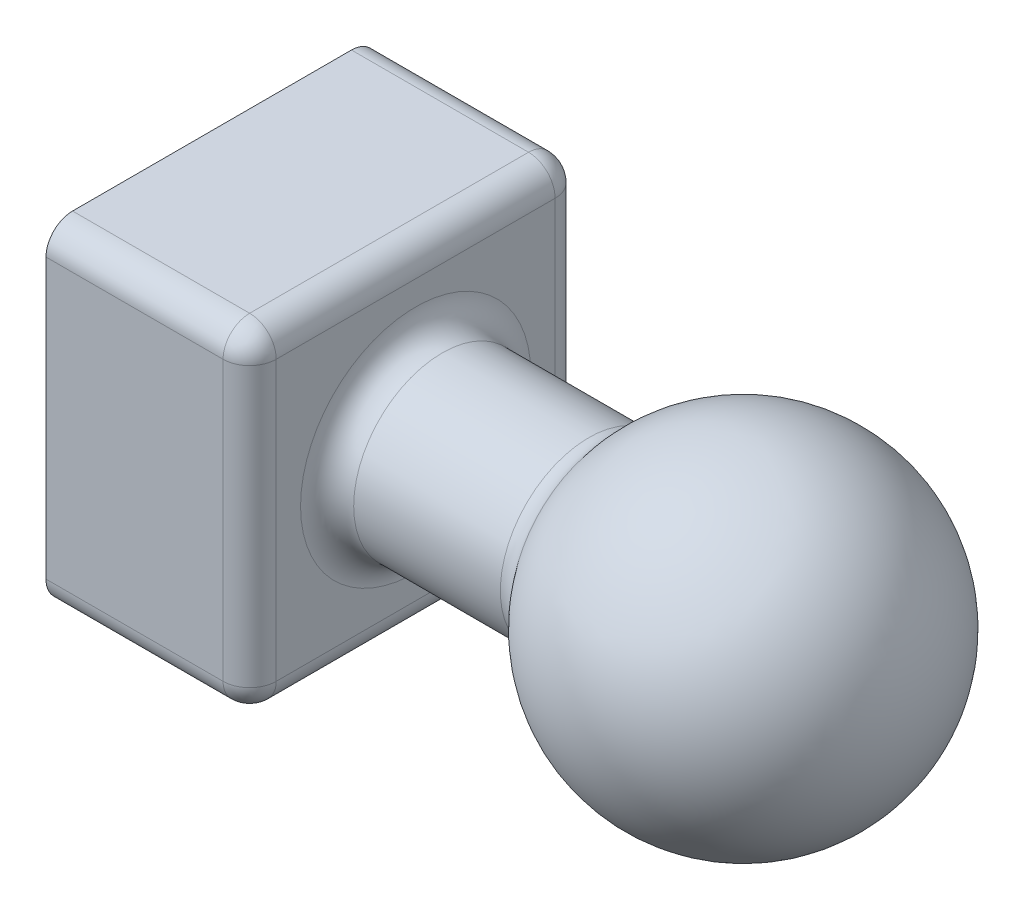
ISO-10303-21;
HEADER;
FILE_DESCRIPTION(('STEP AP214'),'2;1');
FILE_NAME('part.step','',(''),(''),'','','');
FILE_SCHEMA(('AUTOMOTIVE_DESIGN { 1 0 10303 214 1 1 1 1 }'));
ENDSEC;
DATA;
#1=APPLICATION_CONTEXT('core data for automotive mechanical design processes');
#2=APPLICATION_PROTOCOL_DEFINITION('international standard','automotive_design',2000,#1);
#3=PRODUCT_CONTEXT('',#1,'mechanical');
#4=PRODUCT('Part','Part','',(#3));
#5=PRODUCT_RELATED_PRODUCT_CATEGORY('part','',(#4));
#6=PRODUCT_DEFINITION_FORMATION('','',#4);
#7=PRODUCT_DEFINITION_CONTEXT('part definition',#1,'design');
#8=PRODUCT_DEFINITION('design','',#6,#7);
#9=PRODUCT_DEFINITION_SHAPE('','',#8);
#10=(LENGTH_UNIT() NAMED_UNIT(*) SI_UNIT(.MILLI.,.METRE.));
#11=(NAMED_UNIT(*) PLANE_ANGLE_UNIT() SI_UNIT($,.RADIAN.));
#12=(NAMED_UNIT(*) SI_UNIT($,.STERADIAN.) SOLID_ANGLE_UNIT());
#13=UNCERTAINTY_MEASURE_WITH_UNIT(LENGTH_MEASURE(1.E-05),#10,'distance_accuracy_value','');
#14=(GEOMETRIC_REPRESENTATION_CONTEXT(3) GLOBAL_UNCERTAINTY_ASSIGNED_CONTEXT((#13)) GLOBAL_UNIT_ASSIGNED_CONTEXT((#10,
#11,#12)) REPRESENTATION_CONTEXT('',''));
#15=CARTESIAN_POINT('',(0.,0.,0.));
#16=DIRECTION('',(0.,0.,1.));
#17=DIRECTION('',(1.,0.,0.));
#18=AXIS2_PLACEMENT_3D('',#15,#16,#17);
#19=CARTESIAN_POINT('',(37.,0.,0.));
#20=DIRECTION('',(1.,0.,0.));
#21=DIRECTION('',(0.,-1.,0.));
#22=AXIS2_PLACEMENT_3D('',#19,#20,#21);
#23=SPHERICAL_SURFACE('',#22,18.75);
#24=CARTESIAN_POINT('',(21.9677689720071,0.,0.));
#25=DIRECTION('',(1.,0.,0.));
#26=DIRECTION('',(0.,0.,-1.));
#27=AXIS2_PLACEMENT_3D('',#24,#25,#26);
#28=CIRCLE('',#27,11.2068965517241);
#29=CARTESIAN_POINT('',(21.9677689720071,0.,-11.2068965517241));
#30=VERTEX_POINT('',#29);
#31=EDGE_CURVE('E186',#30,#30,#28,.T.);
#32=ORIENTED_EDGE('',*,*,#31,.T.);
#33=EDGE_LOOP('',(#32));
#34=FACE_BOUND('',#33,.T.);
#35=ADVANCED_FACE('F39',(#34),#23,.T.);
#36=CARTESIAN_POINT('',(55.75,0.,0.));
#37=DIRECTION('',(1.,0.,0.));
#38=DIRECTION('',(0.,0.,-1.));
#39=AXIS2_PLACEMENT_3D('',#36,#37,#38);
#40=CYLINDRICAL_SURFACE('',#39,10.);
#41=CARTESIAN_POINT('',(3.,0.,0.));
#42=DIRECTION('',(-1.,0.,0.));
#43=DIRECTION('',(0.,0.,1.));
#44=AXIS2_PLACEMENT_3D('',#41,#42,#43);
#45=CIRCLE('',#44,10.);
#46=CARTESIAN_POINT('',(3.,0.,10.));
#47=VERTEX_POINT('',#46);
#48=EDGE_CURVE('E183',#47,#47,#45,.F.);
#49=ORIENTED_EDGE('',*,*,#48,.T.);
#50=EDGE_LOOP('',(#49));
#51=FACE_BOUND('',#50,.T.);
#52=CARTESIAN_POINT('',(19.5626120075282,0.,0.));
#53=DIRECTION('',(1.,0.,0.));
#54=DIRECTION('',(0.,0.,-1.));
#55=AXIS2_PLACEMENT_3D('',#52,#53,#54);
#56=CIRCLE('',#55,10.);
#57=CARTESIAN_POINT('',(19.5626120075282,0.,-10.));
#58=VERTEX_POINT('',#57);
#59=EDGE_CURVE('E180',#58,#58,#56,.F.);
#60=ORIENTED_EDGE('',*,*,#59,.T.);
#61=EDGE_LOOP('',(#60));
#62=FACE_BOUND('',#61,.T.);
#63=ADVANCED_FACE('F236',(#51,#62),#40,.T.);
#64=CARTESIAN_POINT('',(0.,0.,0.));
#65=DIRECTION('',(-1.,0.,0.));
#66=DIRECTION('',(0.,0.,1.));
#67=AXIS2_PLACEMENT_3D('',#64,#65,#66);
#68=PLANE('',#67);
#69=DIRECTION('',(0.,0.,1.));
#70=VECTOR('',#69,1.);
#71=CARTESIAN_POINT('',(0.,-15.75,0.));
#72=LINE('',#71,#70);
#73=CARTESIAN_POINT('',(0.,-15.75,15.75));
#74=VERTEX_POINT('',#73);
#75=CARTESIAN_POINT('',(0.,-15.75,-15.75));
#76=VERTEX_POINT('',#75);
#77=EDGE_CURVE('E54',#74,#76,#72,.F.);
#78=ORIENTED_EDGE('',*,*,#77,.T.);
#79=DIRECTION('',(0.,-1.,0.));
#80=VECTOR('',#79,1.);
#81=CARTESIAN_POINT('',(0.,0.,-15.75));
#82=LINE('',#81,#80);
#83=CARTESIAN_POINT('',(0.,15.75,-15.75));
#84=VERTEX_POINT('',#83);
#85=EDGE_CURVE('E178',#76,#84,#82,.F.);
#86=ORIENTED_EDGE('',*,*,#85,.T.);
#87=DIRECTION('',(0.,0.,-1.));
#88=VECTOR('',#87,1.);
#89=CARTESIAN_POINT('',(0.,15.75,0.));
#90=LINE('',#89,#88);
#91=CARTESIAN_POINT('',(0.,15.75,15.75));
#92=VERTEX_POINT('',#91);
#93=EDGE_CURVE('E175',#84,#92,#90,.F.);
#94=ORIENTED_EDGE('',*,*,#93,.T.);
#95=DIRECTION('',(0.,1.,0.));
#96=VECTOR('',#95,1.);
#97=CARTESIAN_POINT('',(0.,0.,15.75));
#98=LINE('',#97,#96);
#99=EDGE_CURVE('E173',#92,#74,#98,.F.);
#100=ORIENTED_EDGE('',*,*,#99,.T.);
#101=EDGE_LOOP('',(#78,#86,#94,#100));
#102=FACE_BOUND('',#101,.T.);
#103=CARTESIAN_POINT('',(0.,0.,0.));
#104=DIRECTION('',(-1.,0.,0.));
#105=DIRECTION('',(0.,0.,1.));
#106=AXIS2_PLACEMENT_3D('',#103,#104,#105);
#107=CIRCLE('',#106,13.);
#108=CARTESIAN_POINT('',(0.,0.,13.));
#109=VERTEX_POINT('',#108);
#110=EDGE_CURVE('E170',#109,#109,#107,.T.);
#111=ORIENTED_EDGE('',*,*,#110,.T.);
#112=EDGE_LOOP('',(#111));
#113=FACE_BOUND('',#112,.T.);
#114=ADVANCED_FACE('F242',(#102,#113),#68,.F.);
#115=CARTESIAN_POINT('',(-23.,0.,0.));
#116=DIRECTION('',(1.,0.,0.));
#117=DIRECTION('',(0.,0.,-1.));
#118=AXIS2_PLACEMENT_3D('',#115,#116,#117);
#119=PLANE('',#118);
#120=CARTESIAN_POINT('',(-23.,0.,0.));
#121=DIRECTION('',(1.,0.,0.));
#122=DIRECTION('',(0.,0.,-1.));
#123=AXIS2_PLACEMENT_3D('',#120,#121,#122);
#124=CIRCLE('',#123,17.);
#125=CARTESIAN_POINT('',(-23.,0.,-17.));
#126=VERTEX_POINT('',#125);
#127=EDGE_CURVE('E11',#126,#126,#124,.T.);
#128=ORIENTED_EDGE('',*,*,#127,.T.);
#129=EDGE_LOOP('',(#128));
#130=FACE_BOUND('',#129,.T.);
#131=DIRECTION('',(0.,0.,-1.));
#132=VECTOR('',#131,1.);
#133=CARTESIAN_POINT('',(-23.,18.75,-18.75));
#134=LINE('',#133,#132);
#135=CARTESIAN_POINT('',(-23.,18.75,15.75));
#136=VERTEX_POINT('',#135);
#137=CARTESIAN_POINT('',(-23.,18.75,-15.75));
#138=VERTEX_POINT('',#137);
#139=EDGE_CURVE('E126',#136,#138,#134,.T.);
#140=ORIENTED_EDGE('',*,*,#139,.T.);
#141=CARTESIAN_POINT('',(-23.,15.75,-15.75));
#142=DIRECTION('',(1.,0.,0.));
#143=DIRECTION('',(0.,0.,-1.));
#144=AXIS2_PLACEMENT_3D('',#141,#142,#143);
#145=CIRCLE('',#144,3.);
#146=CARTESIAN_POINT('',(-23.,15.75,-18.75));
#147=VERTEX_POINT('',#146);
#148=EDGE_CURVE('E120',#138,#147,#145,.F.);
#149=ORIENTED_EDGE('',*,*,#148,.T.);
#150=DIRECTION('',(0.,-1.,0.));
#151=VECTOR('',#150,1.);
#152=CARTESIAN_POINT('',(-23.,-18.75,-18.75));
#153=LINE('',#152,#151);
#154=CARTESIAN_POINT('',(-23.,-15.75,-18.75));
#155=VERTEX_POINT('',#154);
#156=EDGE_CURVE('E123',#147,#155,#153,.T.);
#157=ORIENTED_EDGE('',*,*,#156,.T.);
#158=CARTESIAN_POINT('',(-23.,-15.75,-15.75));
#159=DIRECTION('',(1.,0.,0.));
#160=DIRECTION('',(0.,0.,-1.));
#161=AXIS2_PLACEMENT_3D('',#158,#159,#160);
#162=CIRCLE('',#161,3.);
#163=CARTESIAN_POINT('',(-23.,-18.75,-15.75));
#164=VERTEX_POINT('',#163);
#165=EDGE_CURVE('E131',#155,#164,#162,.F.);
#166=ORIENTED_EDGE('',*,*,#165,.T.);
#167=DIRECTION('',(0.,0.,1.));
#168=VECTOR('',#167,1.);
#169=CARTESIAN_POINT('',(-23.,-18.75,-18.75));
#170=LINE('',#169,#168);
#171=CARTESIAN_POINT('',(-23.,-18.75,15.75));
#172=VERTEX_POINT('',#171);
#173=EDGE_CURVE('E139',#164,#172,#170,.T.);
#174=ORIENTED_EDGE('',*,*,#173,.T.);
#175=CARTESIAN_POINT('',(-23.,-15.75,15.75));
#176=DIRECTION('',(1.,0.,0.));
#177=DIRECTION('',(0.,0.,-1.));
#178=AXIS2_PLACEMENT_3D('',#175,#176,#177);
#179=CIRCLE('',#178,3.);
#180=CARTESIAN_POINT('',(-23.,-15.75,18.75));
#181=VERTEX_POINT('',#180);
#182=EDGE_CURVE('E154',#172,#181,#179,.F.);
#183=ORIENTED_EDGE('',*,*,#182,.T.);
#184=DIRECTION('',(0.,1.,0.));
#185=VECTOR('',#184,1.);
#186=CARTESIAN_POINT('',(-23.,-18.75,18.75));
#187=LINE('',#186,#185);
#188=CARTESIAN_POINT('',(-23.,15.75,18.75));
#189=VERTEX_POINT('',#188);
#190=EDGE_CURVE('E219',#181,#189,#187,.T.);
#191=ORIENTED_EDGE('',*,*,#190,.T.);
#192=CARTESIAN_POINT('',(-23.,15.75,15.75));
#193=DIRECTION('',(1.,0.,0.));
#194=DIRECTION('',(0.,0.,-1.));
#195=AXIS2_PLACEMENT_3D('',#192,#193,#194);
#196=CIRCLE('',#195,3.);
#197=EDGE_CURVE('E156',#189,#136,#196,.F.);
#198=ORIENTED_EDGE('',*,*,#197,.T.);
#199=EDGE_LOOP('',(#140,#149,#157,#166,#174,#183,#191,#198));
#200=FACE_BOUND('',#199,.T.);
#201=ADVANCED_FACE('F122',(#130,#200),#119,.F.);
#202=CARTESIAN_POINT('',(-23.,-18.75,18.75));
#203=DIRECTION('',(0.,0.,-1.));
#204=DIRECTION('',(0.,1.,0.));
#205=AXIS2_PLACEMENT_3D('',#202,#203,#204);
#206=PLANE('',#205);
#207=DIRECTION('',(0.,1.,0.));
#208=VECTOR('',#207,1.);
#209=CARTESIAN_POINT('',(-3.,-18.75,18.75));
#210=LINE('',#209,#208);
#211=CARTESIAN_POINT('',(-3.,-15.75,18.75));
#212=VERTEX_POINT('',#211);
#213=CARTESIAN_POINT('',(-3.,15.75,18.75));
#214=VERTEX_POINT('',#213);
#215=EDGE_CURVE('E164',#212,#214,#210,.T.);
#216=ORIENTED_EDGE('',*,*,#215,.T.);
#217=DIRECTION('',(1.,0.,0.));
#218=VECTOR('',#217,1.);
#219=CARTESIAN_POINT('',(-23.,15.75,18.75));
#220=LINE('',#219,#218);
#221=EDGE_CURVE('E168',#214,#189,#220,.F.);
#222=ORIENTED_EDGE('',*,*,#221,.T.);
#223=ORIENTED_EDGE('',*,*,#190,.F.);
#224=DIRECTION('',(1.,0.,0.));
#225=VECTOR('',#224,1.);
#226=CARTESIAN_POINT('',(-23.,-15.75,18.75));
#227=LINE('',#226,#225);
#228=EDGE_CURVE('E166',#181,#212,#227,.T.);
#229=ORIENTED_EDGE('',*,*,#228,.T.);
#230=EDGE_LOOP('',(#216,#222,#223,#229));
#231=FACE_BOUND('',#230,.T.);
#232=ADVANCED_FACE('F309',(#231),#206,.F.);
#233=CARTESIAN_POINT('',(-23.,18.75,-18.75));
#234=DIRECTION('',(0.,-1.,0.));
#235=DIRECTION('',(0.,0.,-1.));
#236=AXIS2_PLACEMENT_3D('',#233,#234,#235);
#237=PLANE('',#236);
#238=DIRECTION('',(0.,0.,-1.));
#239=VECTOR('',#238,1.);
#240=CARTESIAN_POINT('',(-3.,18.75,-18.75));
#241=LINE('',#240,#239);
#242=CARTESIAN_POINT('',(-3.,18.75,15.75));
#243=VERTEX_POINT('',#242);
#244=CARTESIAN_POINT('',(-3.,18.75,-15.75));
#245=VERTEX_POINT('',#244);
#246=EDGE_CURVE('E143',#243,#245,#241,.T.);
#247=ORIENTED_EDGE('',*,*,#246,.T.);
#248=DIRECTION('',(1.,0.,0.));
#249=VECTOR('',#248,1.);
#250=CARTESIAN_POINT('',(-23.,18.75,-15.75));
#251=LINE('',#250,#249);
#252=EDGE_CURVE('E152',#245,#138,#251,.F.);
#253=ORIENTED_EDGE('',*,*,#252,.T.);
#254=ORIENTED_EDGE('',*,*,#139,.F.);
#255=DIRECTION('',(1.,0.,0.));
#256=VECTOR('',#255,1.);
#257=CARTESIAN_POINT('',(-23.,18.75,15.75));
#258=LINE('',#257,#256);
#259=EDGE_CURVE('E145',#136,#243,#258,.T.);
#260=ORIENTED_EDGE('',*,*,#259,.T.);
#261=EDGE_LOOP('',(#247,#253,#254,#260));
#262=FACE_BOUND('',#261,.T.);
#263=ADVANCED_FACE('F318',(#262),#237,.F.);
#264=CARTESIAN_POINT('',(-23.,-18.75,-18.75));
#265=DIRECTION('',(0.,0.,1.));
#266=DIRECTION('',(1.,0.,0.));
#267=AXIS2_PLACEMENT_3D('',#264,#265,#266);
#268=PLANE('',#267);
#269=ORIENTED_EDGE('',*,*,#156,.F.);
#270=DIRECTION('',(1.,0.,0.));
#271=VECTOR('',#270,1.);
#272=CARTESIAN_POINT('',(-23.,15.75,-18.75));
#273=LINE('',#272,#271);
#274=CARTESIAN_POINT('',(-3.,15.75,-18.75));
#275=VERTEX_POINT('',#274);
#276=EDGE_CURVE('E136',#147,#275,#273,.T.);
#277=ORIENTED_EDGE('',*,*,#276,.T.);
#278=DIRECTION('',(0.,-1.,0.));
#279=VECTOR('',#278,1.);
#280=CARTESIAN_POINT('',(-3.,-18.75,-18.75));
#281=LINE('',#280,#279);
#282=CARTESIAN_POINT('',(-3.,-15.75,-18.75));
#283=VERTEX_POINT('',#282);
#284=EDGE_CURVE('E147',#275,#283,#281,.T.);
#285=ORIENTED_EDGE('',*,*,#284,.T.);
#286=DIRECTION('',(1.,0.,0.));
#287=VECTOR('',#286,1.);
#288=CARTESIAN_POINT('',(-23.,-15.75,-18.75));
#289=LINE('',#288,#287);
#290=EDGE_CURVE('E138',#283,#155,#289,.F.);
#291=ORIENTED_EDGE('',*,*,#290,.T.);
#292=EDGE_LOOP('',(#269,#277,#285,#291));
#293=FACE_BOUND('',#292,.T.);
#294=ADVANCED_FACE('F135',(#293),#268,.F.);
#295=CARTESIAN_POINT('',(-23.,-18.75,-18.75));
#296=DIRECTION('',(0.,1.,0.));
#297=DIRECTION('',(0.,0.,1.));
#298=AXIS2_PLACEMENT_3D('',#295,#296,#297);
#299=PLANE('',#298);
#300=ORIENTED_EDGE('',*,*,#173,.F.);
#301=DIRECTION('',(1.,0.,0.));
#302=VECTOR('',#301,1.);
#303=CARTESIAN_POINT('',(-23.,-18.75,-15.75));
#304=LINE('',#303,#302);
#305=CARTESIAN_POINT('',(-3.,-18.75,-15.75));
#306=VERTEX_POINT('',#305);
#307=EDGE_CURVE('E162',#164,#306,#304,.T.);
#308=ORIENTED_EDGE('',*,*,#307,.T.);
#309=DIRECTION('',(0.,0.,1.));
#310=VECTOR('',#309,1.);
#311=CARTESIAN_POINT('',(-3.,-18.75,-18.75));
#312=LINE('',#311,#310);
#313=CARTESIAN_POINT('',(-3.,-18.75,15.75));
#314=VERTEX_POINT('',#313);
#315=EDGE_CURVE('E130',#306,#314,#312,.T.);
#316=ORIENTED_EDGE('',*,*,#315,.T.);
#317=DIRECTION('',(1.,0.,0.));
#318=VECTOR('',#317,1.);
#319=CARTESIAN_POINT('',(-23.,-18.75,15.75));
#320=LINE('',#319,#318);
#321=EDGE_CURVE('E160',#314,#172,#320,.F.);
#322=ORIENTED_EDGE('',*,*,#321,.T.);
#323=EDGE_LOOP('',(#300,#308,#316,#322));
#324=FACE_BOUND('',#323,.T.);
#325=ADVANCED_FACE('F325',(#324),#299,.F.);
#326=CARTESIAN_POINT('',(-23.,0.,0.));
#327=DIRECTION('',(1.,0.,0.));
#328=DIRECTION('',(0.,0.,-1.));
#329=AXIS2_PLACEMENT_3D('',#326,#327,#328);
#330=CYLINDRICAL_SURFACE('',#329,15.);
#331=CARTESIAN_POINT('',(-21.,0.,0.));
#332=DIRECTION('',(1.,0.,0.));
#333=DIRECTION('',(0.,0.,-1.));
#334=AXIS2_PLACEMENT_3D('',#331,#332,#333);
#335=CIRCLE('',#334,15.);
#336=CARTESIAN_POINT('',(-21.,0.,-15.));
#337=VERTEX_POINT('',#336);
#338=EDGE_CURVE('E47',#337,#337,#335,.F.);
#339=ORIENTED_EDGE('',*,*,#338,.T.);
#340=EDGE_LOOP('',(#339));
#341=FACE_BOUND('',#340,.T.);
#342=CARTESIAN_POINT('',(-3.,0.,0.));
#343=DIRECTION('',(-1.,0.,0.));
#344=DIRECTION('',(0.,0.,1.));
#345=AXIS2_PLACEMENT_3D('',#342,#343,#344);
#346=CIRCLE('',#345,15.);
#347=CARTESIAN_POINT('',(-3.,0.,15.));
#348=VERTEX_POINT('',#347);
#349=EDGE_CURVE('E531',#348,#348,#346,.F.);
#350=ORIENTED_EDGE('',*,*,#349,.T.);
#351=EDGE_LOOP('',(#350));
#352=FACE_BOUND('',#351,.T.);
#353=ADVANCED_FACE('F223',(#341,#352),#330,.F.);
#354=CARTESIAN_POINT('',(-3.,0.,0.));
#355=DIRECTION('',(-1.,0.,0.));
#356=DIRECTION('',(0.,0.,1.));
#357=AXIS2_PLACEMENT_3D('',#354,#355,#356);
#358=PLANE('',#357);
#359=ORIENTED_EDGE('',*,*,#349,.F.);
#360=EDGE_LOOP('',(#359));
#361=FACE_BOUND('',#360,.T.);
#362=ADVANCED_FACE('F291',(#361),#358,.T.);
#363=CARTESIAN_POINT('',(-23.,-15.75,15.75));
#364=DIRECTION('',(1.,0.,0.));
#365=DIRECTION('',(0.,0.,-1.));
#366=AXIS2_PLACEMENT_3D('',#363,#364,#365);
#367=CYLINDRICAL_SURFACE('',#366,3.);
#368=CARTESIAN_POINT('',(-3.,-15.75,15.75));
#369=DIRECTION('',(1.,0.,0.));
#370=DIRECTION('',(0.,0.,-1.));
#371=AXIS2_PLACEMENT_3D('',#368,#369,#370);
#372=CIRCLE('',#371,3.);
#373=EDGE_CURVE('E217',#212,#314,#372,.T.);
#374=ORIENTED_EDGE('',*,*,#373,.F.);
#375=ORIENTED_EDGE('',*,*,#228,.F.);
#376=ORIENTED_EDGE('',*,*,#182,.F.);
#377=ORIENTED_EDGE('',*,*,#321,.F.);
#378=EDGE_LOOP('',(#374,#375,#376,#377));
#379=FACE_BOUND('',#378,.T.);
#380=ADVANCED_FACE('F287',(#379),#367,.T.);
#381=CARTESIAN_POINT('',(-3.,-15.75,15.75));
#382=DIRECTION('',(0.,-1.,0.));
#383=DIRECTION('',(1.,0.,0.));
#384=AXIS2_PLACEMENT_3D('',#381,#382,#383);
#385=SPHERICAL_SURFACE('',#384,3.);
#386=CARTESIAN_POINT('',(-3.,-15.75,15.75));
#387=DIRECTION('',(0.,-1.,0.));
#388=DIRECTION('',(0.,0.,-1.));
#389=AXIS2_PLACEMENT_3D('',#386,#387,#388);
#390=CIRCLE('',#389,3.);
#391=EDGE_CURVE('E211',#212,#74,#390,.F.);
#392=ORIENTED_EDGE('',*,*,#391,.F.);
#393=ORIENTED_EDGE('',*,*,#373,.T.);
#394=CARTESIAN_POINT('',(-3.,-15.75,15.75));
#395=DIRECTION('',(0.,0.,1.));
#396=DIRECTION('',(1.,0.,0.));
#397=AXIS2_PLACEMENT_3D('',#394,#395,#396);
#398=CIRCLE('',#397,3.);
#399=EDGE_CURVE('E214',#74,#314,#398,.F.);
#400=ORIENTED_EDGE('',*,*,#399,.F.);
#401=EDGE_LOOP('',(#392,#393,#400));
#402=FACE_BOUND('',#401,.T.);
#403=ADVANCED_FACE('F283',(#402),#385,.T.);
#404=CARTESIAN_POINT('',(-23.,-15.75,-15.75));
#405=DIRECTION('',(1.,0.,0.));
#406=DIRECTION('',(0.,0.,-1.));
#407=AXIS2_PLACEMENT_3D('',#404,#405,#406);
#408=CYLINDRICAL_SURFACE('',#407,3.);
#409=ORIENTED_EDGE('',*,*,#165,.F.);
#410=ORIENTED_EDGE('',*,*,#290,.F.);
#411=CARTESIAN_POINT('',(-3.,-15.75,-15.75));
#412=DIRECTION('',(1.,0.,0.));
#413=DIRECTION('',(0.,0.,-1.));
#414=AXIS2_PLACEMENT_3D('',#411,#412,#413);
#415=CIRCLE('',#414,3.);
#416=EDGE_CURVE('E208',#306,#283,#415,.T.);
#417=ORIENTED_EDGE('',*,*,#416,.F.);
#418=ORIENTED_EDGE('',*,*,#307,.F.);
#419=EDGE_LOOP('',(#409,#410,#417,#418));
#420=FACE_BOUND('',#419,.T.);
#421=ADVANCED_FACE('F279',(#420),#408,.T.);
#422=CARTESIAN_POINT('',(-3.,-15.75,-18.75));
#423=DIRECTION('',(0.,0.,1.));
#424=DIRECTION('',(1.,0.,0.));
#425=AXIS2_PLACEMENT_3D('',#422,#423,#424);
#426=CYLINDRICAL_SURFACE('',#425,3.);
#427=ORIENTED_EDGE('',*,*,#399,.T.);
#428=ORIENTED_EDGE('',*,*,#315,.F.);
#429=CARTESIAN_POINT('',(-3.,-15.75,-15.75));
#430=DIRECTION('',(0.,0.,-1.));
#431=DIRECTION('',(-1.,0.,0.));
#432=AXIS2_PLACEMENT_3D('',#429,#430,#431);
#433=CIRCLE('',#432,3.);
#434=EDGE_CURVE('E205',#76,#306,#433,.T.);
#435=ORIENTED_EDGE('',*,*,#434,.F.);
#436=ORIENTED_EDGE('',*,*,#77,.F.);
#437=EDGE_LOOP('',(#427,#428,#435,#436));
#438=FACE_BOUND('',#437,.T.);
#439=ADVANCED_FACE('F275',(#438),#426,.T.);
#440=CARTESIAN_POINT('',(-3.,-18.75,15.75));
#441=DIRECTION('',(0.,1.,0.));
#442=DIRECTION('',(0.,0.,1.));
#443=AXIS2_PLACEMENT_3D('',#440,#441,#442);
#444=CYLINDRICAL_SURFACE('',#443,3.);
#445=ORIENTED_EDGE('',*,*,#391,.T.);
#446=ORIENTED_EDGE('',*,*,#99,.F.);
#447=CARTESIAN_POINT('',(-3.,15.75,15.75));
#448=DIRECTION('',(0.,1.,0.));
#449=DIRECTION('',(0.,0.,1.));
#450=AXIS2_PLACEMENT_3D('',#447,#448,#449);
#451=CIRCLE('',#450,3.);
#452=EDGE_CURVE('E202',#214,#92,#451,.T.);
#453=ORIENTED_EDGE('',*,*,#452,.F.);
#454=ORIENTED_EDGE('',*,*,#215,.F.);
#455=EDGE_LOOP('',(#445,#446,#453,#454));
#456=FACE_BOUND('',#455,.T.);
#457=ADVANCED_FACE('F271',(#456),#444,.T.);
#458=CARTESIAN_POINT('',(-23.,15.75,15.75));
#459=DIRECTION('',(1.,0.,0.));
#460=DIRECTION('',(0.,0.,-1.));
#461=AXIS2_PLACEMENT_3D('',#458,#459,#460);
#462=CYLINDRICAL_SURFACE('',#461,3.);
#463=ORIENTED_EDGE('',*,*,#197,.F.);
#464=ORIENTED_EDGE('',*,*,#221,.F.);
#465=CARTESIAN_POINT('',(-3.,15.75,15.75));
#466=DIRECTION('',(1.,0.,0.));
#467=DIRECTION('',(0.,0.,-1.));
#468=AXIS2_PLACEMENT_3D('',#465,#466,#467);
#469=CIRCLE('',#468,3.);
#470=EDGE_CURVE('E199',#243,#214,#469,.T.);
#471=ORIENTED_EDGE('',*,*,#470,.F.);
#472=ORIENTED_EDGE('',*,*,#259,.F.);
#473=EDGE_LOOP('',(#463,#464,#471,#472));
#474=FACE_BOUND('',#473,.T.);
#475=ADVANCED_FACE('F267',(#474),#462,.T.);
#476=CARTESIAN_POINT('',(-3.,-15.75,-15.75));
#477=DIRECTION('',(0.,-1.,0.));
#478=DIRECTION('',(1.,0.,0.));
#479=AXIS2_PLACEMENT_3D('',#476,#477,#478);
#480=SPHERICAL_SURFACE('',#479,3.);
#481=ORIENTED_EDGE('',*,*,#434,.T.);
#482=ORIENTED_EDGE('',*,*,#416,.T.);
#483=CARTESIAN_POINT('',(-3.,-15.75,-15.75));
#484=DIRECTION('',(0.,-1.,0.));
#485=DIRECTION('',(0.,0.,-1.));
#486=AXIS2_PLACEMENT_3D('',#483,#484,#485);
#487=CIRCLE('',#486,3.);
#488=EDGE_CURVE('E196',#76,#283,#487,.F.);
#489=ORIENTED_EDGE('',*,*,#488,.F.);
#490=EDGE_LOOP('',(#481,#482,#489));
#491=FACE_BOUND('',#490,.T.);
#492=ADVANCED_FACE('F263',(#491),#480,.T.);
#493=CARTESIAN_POINT('',(-3.,15.75,15.75));
#494=DIRECTION('',(0.,0.,1.));
#495=DIRECTION('',(1.,0.,0.));
#496=AXIS2_PLACEMENT_3D('',#493,#494,#495);
#497=SPHERICAL_SURFACE('',#496,3.);
#498=ORIENTED_EDGE('',*,*,#470,.T.);
#499=ORIENTED_EDGE('',*,*,#452,.T.);
#500=CARTESIAN_POINT('',(-3.,15.75,15.75));
#501=DIRECTION('',(0.,0.,1.));
#502=DIRECTION('',(0.,-1.,0.));
#503=AXIS2_PLACEMENT_3D('',#500,#501,#502);
#504=CIRCLE('',#503,3.);
#505=EDGE_CURVE('E193',#243,#92,#504,.F.);
#506=ORIENTED_EDGE('',*,*,#505,.F.);
#507=EDGE_LOOP('',(#498,#499,#506));
#508=FACE_BOUND('',#507,.T.);
#509=ADVANCED_FACE('F259',(#508),#497,.T.);
#510=CARTESIAN_POINT('',(-3.,-18.75,-15.75));
#511=DIRECTION('',(0.,-1.,0.));
#512=DIRECTION('',(0.,0.,-1.));
#513=AXIS2_PLACEMENT_3D('',#510,#511,#512);
#514=CYLINDRICAL_SURFACE('',#513,3.);
#515=ORIENTED_EDGE('',*,*,#488,.T.);
#516=ORIENTED_EDGE('',*,*,#284,.F.);
#517=CARTESIAN_POINT('',(-3.,15.75,-15.75));
#518=DIRECTION('',(0.,1.,0.));
#519=DIRECTION('',(0.,0.,1.));
#520=AXIS2_PLACEMENT_3D('',#517,#518,#519);
#521=CIRCLE('',#520,3.);
#522=EDGE_CURVE('E191',#84,#275,#521,.T.);
#523=ORIENTED_EDGE('',*,*,#522,.F.);
#524=ORIENTED_EDGE('',*,*,#85,.F.);
#525=EDGE_LOOP('',(#515,#516,#523,#524));
#526=FACE_BOUND('',#525,.T.);
#527=ADVANCED_FACE('F255',(#526),#514,.T.);
#528=CARTESIAN_POINT('',(-3.,15.75,-18.75));
#529=DIRECTION('',(0.,0.,-1.));
#530=DIRECTION('',(-1.,0.,0.));
#531=AXIS2_PLACEMENT_3D('',#528,#529,#530);
#532=CYLINDRICAL_SURFACE('',#531,3.);
#533=ORIENTED_EDGE('',*,*,#505,.T.);
#534=ORIENTED_EDGE('',*,*,#93,.F.);
#535=CARTESIAN_POINT('',(-3.,15.75,-15.75));
#536=DIRECTION('',(0.,0.,-1.));
#537=DIRECTION('',(-1.,0.,0.));
#538=AXIS2_PLACEMENT_3D('',#535,#536,#537);
#539=CIRCLE('',#538,3.);
#540=EDGE_CURVE('E62',#245,#84,#539,.T.);
#541=ORIENTED_EDGE('',*,*,#540,.F.);
#542=ORIENTED_EDGE('',*,*,#246,.F.);
#543=EDGE_LOOP('',(#533,#534,#541,#542));
#544=FACE_BOUND('',#543,.T.);
#545=ADVANCED_FACE('F252',(#544),#532,.T.);
#546=CARTESIAN_POINT('',(-3.,15.75,-15.75));
#547=DIRECTION('',(1.,0.,0.));
#548=DIRECTION('',(0.,0.,-1.));
#549=AXIS2_PLACEMENT_3D('',#546,#547,#548);
#550=SPHERICAL_SURFACE('',#549,3.);
#551=ORIENTED_EDGE('',*,*,#540,.T.);
#552=ORIENTED_EDGE('',*,*,#522,.T.);
#553=CARTESIAN_POINT('',(-3.,15.75,-15.75));
#554=DIRECTION('',(1.,0.,0.));
#555=DIRECTION('',(0.,0.,-1.));
#556=AXIS2_PLACEMENT_3D('',#553,#554,#555);
#557=CIRCLE('',#556,3.);
#558=EDGE_CURVE('E142',#245,#275,#557,.F.);
#559=ORIENTED_EDGE('',*,*,#558,.F.);
#560=EDGE_LOOP('',(#551,#552,#559));
#561=FACE_BOUND('',#560,.T.);
#562=ADVANCED_FACE('F249',(#561),#550,.T.);
#563=CARTESIAN_POINT('',(-23.,15.75,-15.75));
#564=DIRECTION('',(1.,0.,0.));
#565=DIRECTION('',(0.,0.,-1.));
#566=AXIS2_PLACEMENT_3D('',#563,#564,#565);
#567=CYLINDRICAL_SURFACE('',#566,3.);
#568=ORIENTED_EDGE('',*,*,#148,.F.);
#569=ORIENTED_EDGE('',*,*,#252,.F.);
#570=ORIENTED_EDGE('',*,*,#558,.T.);
#571=ORIENTED_EDGE('',*,*,#276,.F.);
#572=EDGE_LOOP('',(#568,#569,#570,#571));
#573=FACE_BOUND('',#572,.T.);
#574=ADVANCED_FACE('F141',(#573),#567,.T.);
#575=CARTESIAN_POINT('',(3.,0.,0.));
#576=DIRECTION('',(-1.,0.,0.));
#577=DIRECTION('',(0.,0.,1.));
#578=AXIS2_PLACEMENT_3D('',#575,#576,#577);
#579=TOROIDAL_SURFACE('',#578,13.,3.);
#580=ORIENTED_EDGE('',*,*,#110,.F.);
#581=EDGE_LOOP('',(#580));
#582=FACE_BOUND('',#581,.T.);
#583=ORIENTED_EDGE('',*,*,#48,.F.);
#584=EDGE_LOOP('',(#583));
#585=FACE_BOUND('',#584,.T.);
#586=ADVANCED_FACE('F232',(#582,#585),#579,.F.);
#587=CARTESIAN_POINT('',(19.5626120075282,0.,0.));
#588=DIRECTION('',(1.,0.,0.));
#589=DIRECTION('',(0.,0.,-1.));
#590=AXIS2_PLACEMENT_3D('',#587,#588,#589);
#591=TOROIDAL_SURFACE('',#590,13.,3.);
#592=ORIENTED_EDGE('',*,*,#59,.F.);
#593=EDGE_LOOP('',(#592));
#594=FACE_BOUND('',#593,.T.);
#595=ORIENTED_EDGE('',*,*,#31,.F.);
#596=EDGE_LOOP('',(#595));
#597=FACE_BOUND('',#596,.T.);
#598=ADVANCED_FACE('F227',(#594,#597),#591,.F.);
#599=CARTESIAN_POINT('',(-21.,0.,0.));
#600=DIRECTION('',(1.,0.,0.));
#601=DIRECTION('',(0.,0.,-1.));
#602=AXIS2_PLACEMENT_3D('',#599,#600,#601);
#603=TOROIDAL_SURFACE('',#602,17.,2.);
#604=ORIENTED_EDGE('',*,*,#127,.F.);
#605=EDGE_LOOP('',(#604));
#606=FACE_BOUND('',#605,.T.);
#607=ORIENTED_EDGE('',*,*,#338,.F.);
#608=EDGE_LOOP('',(#607));
#609=FACE_BOUND('',#608,.T.);
#610=ADVANCED_FACE('F41',(#606,#609),#603,.T.);
#611=CLOSED_SHELL('',(#35,#63,#114,#201,#232,#263,#294,#325,#353,#362,#380,#403,#421,#439,#457,
#475,#492,#509,#527,#545,#562,#574,#586,#598,#610));
#612=MANIFOLD_SOLID_BREP('B2',#611);
#613=ADVANCED_BREP_SHAPE_REPRESENTATION('',(#18,#612),#14);
#614=SHAPE_DEFINITION_REPRESENTATION(#9,#613);
ENDSEC;
END-ISO-10303-21;
